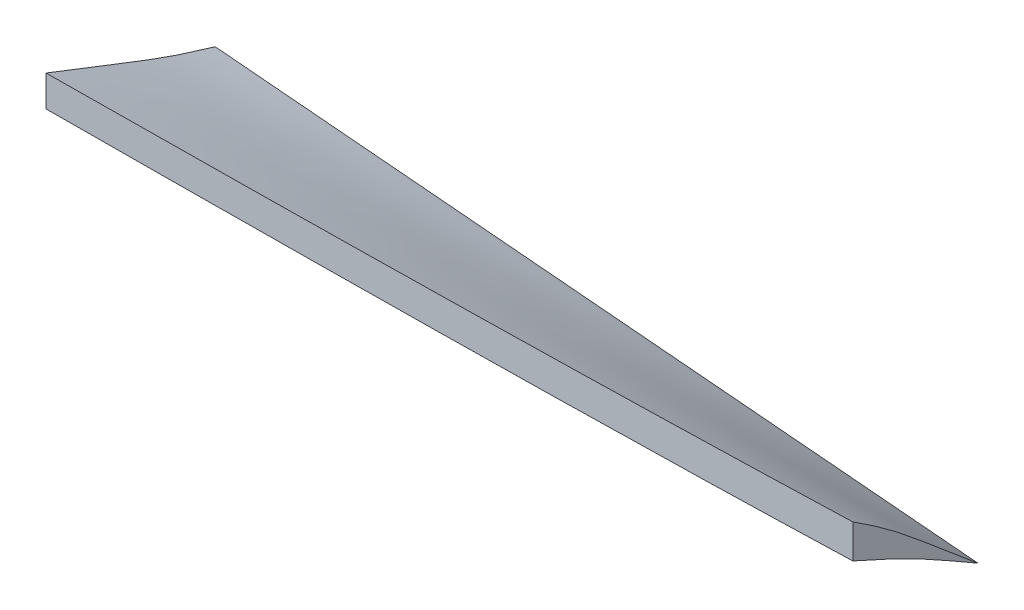
ISO-10303-21;
HEADER;
FILE_DESCRIPTION(('STEP AP214'),'2;1');
FILE_NAME('part.step','',(''),(''),'','','');
FILE_SCHEMA(('AUTOMOTIVE_DESIGN { 1 0 10303 214 1 1 1 1 }'));
ENDSEC;
DATA;
#1=APPLICATION_CONTEXT('core data for automotive mechanical design processes');
#2=APPLICATION_PROTOCOL_DEFINITION('international standard','automotive_design',2000,#1);
#3=PRODUCT_CONTEXT('',#1,'mechanical');
#4=PRODUCT('Part','Part','',(#3));
#5=PRODUCT_RELATED_PRODUCT_CATEGORY('part','',(#4));
#6=PRODUCT_DEFINITION_FORMATION('','',#4);
#7=PRODUCT_DEFINITION_CONTEXT('part definition',#1,'design');
#8=PRODUCT_DEFINITION('design','',#6,#7);
#9=PRODUCT_DEFINITION_SHAPE('','',#8);
#10=(LENGTH_UNIT() NAMED_UNIT(*) SI_UNIT(.MILLI.,.METRE.));
#11=(NAMED_UNIT(*) PLANE_ANGLE_UNIT() SI_UNIT($,.RADIAN.));
#12=(NAMED_UNIT(*) SI_UNIT($,.STERADIAN.) SOLID_ANGLE_UNIT());
#13=UNCERTAINTY_MEASURE_WITH_UNIT(LENGTH_MEASURE(1.E-05),#10,'distance_accuracy_value','');
#14=(GEOMETRIC_REPRESENTATION_CONTEXT(3) GLOBAL_UNCERTAINTY_ASSIGNED_CONTEXT((#13)) GLOBAL_UNIT_ASSIGNED_CONTEXT((#10,
#11,#12)) REPRESENTATION_CONTEXT('',''));
#15=CARTESIAN_POINT('',(0.,0.,0.));
#16=DIRECTION('',(0.,0.,1.));
#17=DIRECTION('',(1.,0.,0.));
#18=AXIS2_PLACEMENT_3D('',#15,#16,#17);
#19=CARTESIAN_POINT('',(374.396,61.9718742803303,-500.462069913375));
#20=DIRECTION('',(1.,0.,0.));
#21=DIRECTION('',(0.,0.,-1.));
#22=AXIS2_PLACEMENT_3D('',#19,#20,#21);
#23=PLANE('',#22);
#24=DIRECTION('',(0.,1.,0.));
#25=VECTOR('',#24,1.);
#26=CARTESIAN_POINT('',(374.396,61.9718742803303,-762.947336932218));
#27=LINE('',#26,#25);
#28=CARTESIAN_POINT('',(374.396,-2.40388597600074,-762.947336932218));
#29=VERTEX_POINT('',#28);
#30=CARTESIAN_POINT('',(374.396,1.23163319584544,-762.94733693398));
#31=VERTEX_POINT('',#30);
#32=EDGE_CURVE('E54',#29,#31,#27,.T.);
#33=ORIENTED_EDGE('',*,*,#32,.F.);
#34=CARTESIAN_POINT('',(374.396,0.,-241.3));
#35=CARTESIAN_POINT('',(374.396,-0.538954659703314,-241.297655184968));
#36=CARTESIAN_POINT('',(374.396,-1.7261603333214,-241.292490042168));
#37=CARTESIAN_POINT('',(374.396,-3.55475690139812,-241.690170496209));
#38=CARTESIAN_POINT('',(374.396,-5.28575044275841,-242.787647348631));
#39=CARTESIAN_POINT('',(374.396,-6.47819703634325,-244.55910096819));
#40=CARTESIAN_POINT('',(374.396,-7.23439961710996,-246.693492664323));
#41=CARTESIAN_POINT('',(374.396,-7.74934951346128,-249.131026639712));
#42=CARTESIAN_POINT('',(374.396,-8.1095524567562,-251.905250666347));
#43=CARTESIAN_POINT('',(374.396,-8.36536130938982,-255.097825264003));
#44=CARTESIAN_POINT('',(374.396,-8.53927775370538,-258.834169307143));
#45=CARTESIAN_POINT('',(374.396,-8.6228222097704,-263.297687326147));
#46=CARTESIAN_POINT('',(374.396,-8.59845411935391,-268.75143324473));
#47=CARTESIAN_POINT('',(374.396,-8.43043441446886,-275.5550068996));
#48=CARTESIAN_POINT('',(374.396,-8.06897383873518,-284.115477039142));
#49=CARTESIAN_POINT('',(374.396,-7.46729611245012,-294.701993416563));
#50=CARTESIAN_POINT('',(374.396,-6.56550935140482,-307.23866248115));
#51=CARTESIAN_POINT('',(374.396,-5.26774660320282,-321.351176792217));
#52=CARTESIAN_POINT('',(374.396,-3.4986121172012,-336.635216144863));
#53=CARTESIAN_POINT('',(374.396,-1.31741885957216,-352.842840734093));
#54=CARTESIAN_POINT('',(374.396,1.12162569591117,-369.80872672652));
#55=CARTESIAN_POINT('',(374.396,3.70484150758706,-387.306924798737));
#56=CARTESIAN_POINT('',(374.396,6.35085572360206,-405.053096077913));
#57=CARTESIAN_POINT('',(374.396,8.98235684046696,-422.799408725511));
#58=CARTESIAN_POINT('',(374.396,11.5300227909959,-440.376908078112));
#59=CARTESIAN_POINT('',(374.396,13.9430010682351,-457.707871031536));
#60=CARTESIAN_POINT('',(374.396,16.1729066622707,-474.772580756103));
#61=CARTESIAN_POINT('',(374.396,18.1852831627042,-491.576454148917));
#62=CARTESIAN_POINT('',(374.396,19.9445194919549,-508.13688707812));
#63=CARTESIAN_POINT('',(374.396,21.4228531653779,-524.480515326682));
#64=CARTESIAN_POINT('',(374.396,22.6006648317829,-540.633952092378));
#65=CARTESIAN_POINT('',(374.396,23.4570220295475,-556.625916689834));
#66=CARTESIAN_POINT('',(374.396,23.9811859014682,-572.479352868524));
#67=CARTESIAN_POINT('',(374.396,24.1589041565962,-588.217968124516));
#68=CARTESIAN_POINT('',(374.396,23.9828437048313,-603.859249005849));
#69=CARTESIAN_POINT('',(374.396,23.4456129995817,-619.418444987461));
#70=CARTESIAN_POINT('',(374.396,22.5455229148943,-634.89794778659));
#71=CARTESIAN_POINT('',(374.396,21.2803649513233,-650.289014071176));
#72=CARTESIAN_POINT('',(374.396,19.6554964574737,-665.556610194271));
#73=CARTESIAN_POINT('',(374.396,17.6770159172737,-680.627419737525));
#74=CARTESIAN_POINT('',(374.396,15.374920464339,-695.363311814011));
#75=CARTESIAN_POINT('',(374.396,12.7828970747854,-709.538692080346));
#76=CARTESIAN_POINT('',(374.396,9.97075851827043,-722.850908635221));
#77=CARTESIAN_POINT('',(374.396,7.01255821457496,-734.983994696583));
#78=CARTESIAN_POINT('',(374.396,3.96652793492765,-745.710637795198));
#79=CARTESIAN_POINT('',(374.396,0.871097223163982,-754.965559992787));
#80=CARTESIAN_POINT('',(374.396,-2.26764612386533,-762.812999366146));
#81=CARTESIAN_POINT('',(374.396,-5.55090807095211,-769.870558630561));
#82=CARTESIAN_POINT('',(374.396,-8.0522393298167,-774.178423342215));
#83=CARTESIAN_POINT('',(374.396,-9.34014397229244,-776.396489798407));
#84=B_SPLINE_CURVE_WITH_KNOTS('',3,(#34,#35,#36,#37,#38,#39,#40,#41,#42,#43,#44,#45,#46,#47,#48,
#49,#50,#51,#52,#53,#54,#55,#56,#57,#58,#59,#60,#61,#62,#63,#64,#65,#66,#67,#68,#69,#70,#71,#72,
#73,#74,#75,#76,#77,#78,#79,#80,#81,#82,#83),.UNSPECIFIED.,.F.,.F.,(4,1,1,1,1,1,1,1,1,1,1,1,1,1,
1,1,1,1,1,1,1,1,1,1,1,1,1,1,1,1,1,1,1,1,1,1,1,1,1,1,1,1,1,1,1,1,1,4),(0.,0.00295699573707231,
0.00651365017947627,0.0101253848931793,0.0139115751929899,0.0180004278100691,0.0225091316382041,
0.0275701977614678,0.0333552559313343,0.0400939348988516,0.0481089397634267,0.0578698759413965,
0.0700431416558855,0.0854823200575231,0.104922628293272,0.128274621706956,0.154506379577485,
0.182746709372674,0.212765692945345,0.244315984766029,0.276878379293871,0.309904596254752,
0.342852711105616,0.375404074373811,0.407445978793529,0.438949076096661,0.469916219615646,
0.500387507784893,0.530404994878598,0.560035323702218,0.589330242489587,0.618350497736926,
0.64714111982614,0.675762770521893,0.704247976592449,0.732632991406434,0.76090944583605,
0.789050397380166,0.816945539223071,0.844377954813452,0.870950736544431,0.89607601673736,
0.91908997684288,0.939522087621465,0.957298390503345,0.972656028240629,0.985920925887869,1.),.UNSPECIFIED.);
#85=CARTESIAN_POINT('',(374.396,-9.34014397229244,-776.396489798407));
#86=VERTEX_POINT('',#85);
#87=EDGE_CURVE('E48',#29,#86,#84,.T.);
#88=ORIENTED_EDGE('',*,*,#87,.T.);
#89=CARTESIAN_POINT('',(374.396,-9.34014397229245,-776.396489798407));
#90=CARTESIAN_POINT('',(374.396,-8.40175484291137,-775.264229702307));
#91=CARTESIAN_POINT('',(374.396,-6.09606028875458,-772.482179211869));
#92=CARTESIAN_POINT('',(374.396,-2.17943506157781,-768.02376491039));
#93=CARTESIAN_POINT('',(374.396,1.84859835881143,-762.218322929233));
#94=CARTESIAN_POINT('',(374.396,5.6003449114185,-755.243229685749));
#95=CARTESIAN_POINT('',(374.396,9.33547168888237,-746.912760700583));
#96=CARTESIAN_POINT('',(374.396,13.2386089066728,-737.018252871707));
#97=CARTESIAN_POINT('',(374.396,17.3161821827427,-725.47867829808));
#98=CARTESIAN_POINT('',(374.396,21.5115819527909,-712.428375502739));
#99=CARTESIAN_POINT('',(374.396,25.7421233345226,-698.167711363482));
#100=CARTESIAN_POINT('',(374.396,29.9240395368495,-683.062552056113));
#101=CARTESIAN_POINT('',(374.396,33.9819197101395,-667.44471749513));
#102=CARTESIAN_POINT('',(374.396,37.8587807196238,-651.563094478592));
#103=CARTESIAN_POINT('',(374.396,41.5075682698668,-635.571677798897));
#104=CARTESIAN_POINT('',(374.396,44.8962045562709,-619.54213496093));
#105=CARTESIAN_POINT('',(374.396,48.0062629675248,-603.480438344816));
#106=CARTESIAN_POINT('',(374.396,50.8384531277133,-587.348007896632));
#107=CARTESIAN_POINT('',(374.396,53.4037267628393,-571.079262558276));
#108=CARTESIAN_POINT('',(374.396,55.7297505453312,-554.597347914761));
#109=CARTESIAN_POINT('',(374.396,57.8518789503547,-537.831743695071));
#110=CARTESIAN_POINT('',(374.396,59.8203943308259,-520.741731840539));
#111=CARTESIAN_POINT('',(374.396,61.6856473828784,-503.340217598354));
#112=CARTESIAN_POINT('',(374.396,63.4899259876005,-485.710728793018));
#113=CARTESIAN_POINT('',(374.396,65.2498913593578,-468.011203683683));
#114=CARTESIAN_POINT('',(374.396,66.9517721977821,-450.459510763352));
#115=CARTESIAN_POINT('',(374.396,68.5378660271085,-433.311455418955));
#116=CARTESIAN_POINT('',(374.396,69.9289151057664,-416.841536857024));
#117=CARTESIAN_POINT('',(374.396,71.0327683067303,-401.296477173787));
#118=CARTESIAN_POINT('',(374.396,71.7296272901284,-386.808729152987));
#119=CARTESIAN_POINT('',(374.396,71.8938086245965,-373.351309186629));
#120=CARTESIAN_POINT('',(374.396,71.4602978508936,-360.783321416241));
#121=CARTESIAN_POINT('',(374.396,70.4184719929158,-348.941977505793));
#122=CARTESIAN_POINT('',(374.396,68.7634225939546,-337.701052477739));
#123=CARTESIAN_POINT('',(374.396,66.4985267442778,-326.980618986022));
#124=CARTESIAN_POINT('',(374.396,63.6364757752088,-316.739864214787));
#125=CARTESIAN_POINT('',(374.396,60.2063348553058,-306.973125092115));
#126=CARTESIAN_POINT('',(374.396,56.2453758331957,-297.713837697883));
#127=CARTESIAN_POINT('',(374.396,51.8366046907402,-289.029736201877));
#128=CARTESIAN_POINT('',(374.396,47.1113365011114,-281.025296442116));
#129=CARTESIAN_POINT('',(374.396,42.2563698958084,-273.817045833498));
#130=CARTESIAN_POINT('',(374.396,37.4675939077021,-267.502444449423));
#131=CARTESIAN_POINT('',(374.396,32.9120113189413,-262.11107633905));
#132=CARTESIAN_POINT('',(374.396,28.6710997916291,-257.609906739654));
#133=CARTESIAN_POINT('',(374.396,24.7595382100328,-253.911291370847));
#134=CARTESIAN_POINT('',(374.396,21.1572388306981,-250.902182399076));
#135=CARTESIAN_POINT('',(374.396,17.8395196406259,-248.463647547404));
#136=CARTESIAN_POINT('',(374.396,14.7801988216139,-246.49190181607));
#137=CARTESIAN_POINT('',(374.396,11.9506148597635,-244.907396988431));
#138=CARTESIAN_POINT('',(374.396,9.32321496425856,-243.64953423366));
#139=CARTESIAN_POINT('',(374.396,6.87061839463228,-242.679778651959));
#140=CARTESIAN_POINT('',(374.396,4.57158692532996,-241.966757378294));
#141=CARTESIAN_POINT('',(374.396,2.40963479027394,-241.495055010141));
#142=CARTESIAN_POINT('',(374.396,0.894237049815755,-241.32398184574));
#143=CARTESIAN_POINT('',(374.396,0.107544091622905,-241.302884141123));
#144=CARTESIAN_POINT('',(374.396,0.,-241.3));
#145=B_SPLINE_CURVE_WITH_KNOTS('',3,(#89,#90,#91,#92,#93,#94,#95,#96,#97,#98,#99,#100,#101,#102,
#103,#104,#105,#106,#107,#108,#109,#110,#111,#112,#113,#114,#115,#116,#117,#118,#119,#120,#121,
#122,#123,#124,#125,#126,#127,#128,#129,#130,#131,#132,#133,#134,#135,#136,#137,#138,#139,#140,
#141,#142,#143,#144),.UNSPECIFIED.,.F.,.F.,(4,1,1,1,1,1,1,1,1,1,1,1,1,1,1,1,1,1,1,1,1,1,1,1,1,1,
1,1,1,1,1,1,1,1,1,1,1,1,1,1,1,1,1,1,1,1,1,1,1,1,1,1,1,4),(0.,0.00766402095757611,
0.0188310913155853,0.0309061878624514,0.044388540676871,0.0600474083532868,0.0784606788934647,
0.0998047207561698,0.123816969987705,0.149890658407643,0.177317925985823,0.205492409209094,
0.233979752311192,0.262509715956203,0.290967606389999,0.319357501013423,0.347763187640679,
0.376320625595132,0.405182950986283,0.434503841432051,0.464386678217646,0.494832433453987,
0.525708038913636,0.556739737234784,0.587525557609377,0.617604809699268,0.646485108208642,
0.67366014348048,0.698815639347954,0.722062593959947,0.743776305511465,0.764323117717657,
0.783977995344401,0.802952239366703,0.821385981311945,0.839352413735504,0.856858699994966,
0.873830573178779,0.890070807540379,0.905268010379337,0.919095859386137,0.931350851483357,
0.942034396352869,0.951307872005367,0.959388407782576,0.966479389489374,0.972752010348399,
0.978344065778329,0.983368996467432,0.987921251922054,0.992076472154305,0.995898893569495,
0.99943936225551,1.),.UNSPECIFIED.);
#146=EDGE_CURVE('E101',#86,#31,#145,.T.);
#147=ORIENTED_EDGE('',*,*,#146,.T.);
#148=EDGE_LOOP('',(#33,#88,#147));
#149=FACE_BOUND('',#148,.T.);
#150=ADVANCED_FACE('F36',(#149),#23,.T.);
#151=CARTESIAN_POINT('',(266.7,66.8514364736246,-396.625549586027));
#152=DIRECTION('',(1.,0.,0.));
#153=DIRECTION('',(0.,0.,-1.));
#154=AXIS2_PLACEMENT_3D('',#151,#152,#153);
#155=PLANE('',#154);
#156=CARTESIAN_POINT('',(266.7,0.,2.22044604925031E-13));
#157=CARTESIAN_POINT('',(266.7,-0.519005663251776,-0.017452032873233));
#158=CARTESIAN_POINT('',(266.7,-1.83376590691603,-0.0616620302726911));
#159=CARTESIAN_POINT('',(266.7,-4.39681155696864,-0.570189514822628));
#160=CARTESIAN_POINT('',(266.7,-10.6163864618155,-2.53612961981586));
#161=CARTESIAN_POINT('',(266.7,-20.5501355548249,-7.99821180015903));
#162=CARTESIAN_POINT('',(266.7,-34.1849518234197,-16.113653600363));
#163=CARTESIAN_POINT('',(266.7,-48.9001609581499,-25.7512677237677));
#164=CARTESIAN_POINT('',(266.7,-62.9387722637982,-36.9320129206593));
#165=CARTESIAN_POINT('',(266.7,-75.9185649305428,-49.3363693895977));
#166=CARTESIAN_POINT('',(266.7,-85.6249870081858,-65.2269065389885));
#167=CARTESIAN_POINT('',(266.7,-91.7173571850375,-84.4527650461813));
#168=CARTESIAN_POINT('',(266.7,-96.1515107337435,-106.852134497504));
#169=CARTESIAN_POINT('',(266.7,-98.572249175019,-132.510932075947));
#170=CARTESIAN_POINT('',(266.7,-99.0923828679342,-161.194365788217));
#171=CARTESIAN_POINT('',(266.7,-97.704243710744,-192.761343292207));
#172=CARTESIAN_POINT('',(266.7,-94.5118392960195,-227.038217577403));
#173=CARTESIAN_POINT('',(266.7,-89.6638281224946,-263.834756502374));
#174=CARTESIAN_POINT('',(266.7,-83.3884450275636,-302.921473177158));
#175=CARTESIAN_POINT('',(266.7,-75.9777868038037,-344.017776041357));
#176=CARTESIAN_POINT('',(266.7,-67.7807073824362,-386.776799789028));
#177=CARTESIAN_POINT('',(266.7,-59.2023239554158,-430.774614869882));
#178=CARTESIAN_POINT('',(266.7,-50.6638051201837,-475.496263681297));
#179=CARTESIAN_POINT('',(266.7,-42.6036124709931,-520.335279967129));
#180=CARTESIAN_POINT('',(266.7,-35.422796347196,-564.588870456406));
#181=CARTESIAN_POINT('',(266.7,-29.4733080838114,-607.47093439981));
#182=CARTESIAN_POINT('',(266.7,-25.0144733830484,-648.127538759038));
#183=CARTESIAN_POINT('',(266.7,-22.1862417822715,-685.667615873134));
#184=CARTESIAN_POINT('',(266.7,-21.0047614095253,-719.196759596281));
#185=CARTESIAN_POINT('',(266.7,-21.2786363122994,-747.830287498173));
#186=CARTESIAN_POINT('',(266.7,-22.8547119223245,-770.688405742853));
#187=CARTESIAN_POINT('',(266.7,-25.0735156397646,-787.091395164078));
#188=CARTESIAN_POINT('',(266.7,-26.8193281874778,-796.842303094878));
#189=CARTESIAN_POINT('',(266.7,-27.7751407453036,-801.097715574997));
#190=CARTESIAN_POINT('',(266.7,-28.0117320332951,-802.151053398607));
#191=B_SPLINE_CURVE_WITH_KNOTS('',3,(#156,#157,#158,#159,#160,#161,#162,#163,#164,#165,#166,
#167,#168,#169,#170,#171,#172,#173,#174,#175,#176,#177,#178,#179,#180,#181,#182,#183,#184,#185,
#186,#187,#188,#189,#190),.UNSPECIFIED.,.F.,.F.,(4,1,1,1,1,1,1,1,1,1,1,1,1,1,1,1,1,1,1,1,1,1,1,
1,1,1,1,1,1,1,1,1,4),(0.,0.00182090933464196,0.00461278049497482,0.00913453013845994,
0.0246759391487866,0.0441527676320363,0.064937102928184,0.0863209881898911,0.107137618403306,
0.127599776801144,0.150892792929449,0.177565203441126,0.207667777211646,0.241222088418686,
0.278203414074027,0.318526302563412,0.362030578586225,0.408464624639153,0.457479061609077,
0.508614437318857,0.56129601455956,0.61483529472868,0.668437533813961,0.721214466101836,
0.772202341152847,0.82039348306447,0.86476592329606,0.904323703961063,0.938131580580512,
0.965241743376092,0.984690446789536,0.996210442222917,1.),.UNSPECIFIED.);
#192=CARTESIAN_POINT('',(266.7,-24.7019448750279,-783.964772228695));
#193=VERTEX_POINT('',#192);
#194=CARTESIAN_POINT('',(266.7,-28.0117320332951,-802.151053398607));
#195=VERTEX_POINT('',#194);
#196=EDGE_CURVE('E82',#193,#195,#191,.T.);
#197=ORIENTED_EDGE('',*,*,#196,.F.);
#198=DIRECTION('',(0.,1.,0.));
#199=VECTOR('',#198,1.);
#200=CARTESIAN_POINT('',(266.7,66.8514364736246,-783.964772228695));
#201=LINE('',#200,#199);
#202=CARTESIAN_POINT('',(266.7,-21.3623541395567,-783.964772228696));
#203=VERTEX_POINT('',#202);
#204=EDGE_CURVE('E73',#193,#203,#201,.T.);
#205=ORIENTED_EDGE('',*,*,#204,.T.);
#206=CARTESIAN_POINT('',(266.7,-28.0117320332951,-802.151053398607));
#207=CARTESIAN_POINT('',(266.7,-27.7105421234966,-801.137231832083));
#208=CARTESIAN_POINT('',(266.7,-26.5641562509699,-797.278434829008));
#209=CARTESIAN_POINT('',(266.7,-23.4586005929746,-789.35722595566));
#210=CARTESIAN_POINT('',(266.7,-18.6435790763109,-777.06146068027));
#211=CARTESIAN_POINT('',(266.7,-13.040064965801,-760.58172221373));
#212=CARTESIAN_POINT('',(266.7,-7.12332820026992,-739.996750309987));
#213=CARTESIAN_POINT('',(266.7,-0.379813283306496,-715.577161880766));
#214=CARTESIAN_POINT('',(266.7,7.01302179788049,-687.646997388513));
#215=CARTESIAN_POINT('',(266.7,14.9584437350902,-656.683490082779));
#216=CARTESIAN_POINT('',(266.7,23.2583450492186,-623.158916560123));
#217=CARTESIAN_POINT('',(266.7,31.6943761736925,-587.549187867879));
#218=CARTESIAN_POINT('',(266.7,40.0261592775311,-550.319226889966));
#219=CARTESIAN_POINT('',(266.7,48.0016259470944,-511.914813654682));
#220=CARTESIAN_POINT('',(266.7,55.374538475184,-472.761711336735));
#221=CARTESIAN_POINT('',(266.7,61.9127756173434,-433.262164148353));
#222=CARTESIAN_POINT('',(266.7,67.4048011857756,-393.795881301525));
#223=CARTESIAN_POINT('',(266.7,71.6551802592197,-354.719946084274));
#224=CARTESIAN_POINT('',(266.7,74.5356984510162,-316.356950184387));
#225=CARTESIAN_POINT('',(266.7,75.7535877143672,-278.931254813949));
#226=CARTESIAN_POINT('',(266.7,75.3938232860087,-242.699408929629));
#227=CARTESIAN_POINT('',(266.7,73.5466559514521,-207.870582877245));
#228=CARTESIAN_POINT('',(266.7,70.2589806515456,-174.746776105023));
#229=CARTESIAN_POINT('',(266.7,65.7681833795225,-143.601377812806));
#230=CARTESIAN_POINT('',(266.7,60.1874606388896,-114.762118238696));
#231=CARTESIAN_POINT('',(266.7,53.6284711641162,-88.5344901534683));
#232=CARTESIAN_POINT('',(266.7,46.23822310474,-65.1989800417861));
#233=CARTESIAN_POINT('',(266.7,38.1338729096921,-45.0005898028449));
#234=CARTESIAN_POINT('',(266.7,29.5092329050107,-28.1586169294015));
#235=CARTESIAN_POINT('',(266.7,20.5578270147687,-14.8710331109794));
#236=CARTESIAN_POINT('',(266.7,12.3132643573259,-6.14419143155653));
#237=CARTESIAN_POINT('',(266.7,6.17648660124204,-1.9481025776692));
#238=CARTESIAN_POINT('',(266.7,3.0841226330873,-0.639134364117389));
#239=CARTESIAN_POINT('',(266.7,1.66803034708105,-0.217045478239974));
#240=CARTESIAN_POINT('',(266.7,0.777840261453222,-0.042563088957337));
#241=CARTESIAN_POINT('',(266.7,0.196310087295787,-0.0107420046178697));
#242=CARTESIAN_POINT('',(266.7,0.,0.));
#243=B_SPLINE_CURVE_WITH_KNOTS('',3,(#206,#207,#208,#209,#210,#211,#212,#213,#214,#215,#216,
#217,#218,#219,#220,#221,#222,#223,#224,#225,#226,#227,#228,#229,#230,#231,#232,#233,#234,#235,
#236,#237,#238,#239,#240,#241,#242),.UNSPECIFIED.,.F.,.F.,(4,1,1,1,1,1,1,1,1,1,1,1,1,1,1,1,1,1,
1,1,1,1,1,1,1,1,1,1,1,1,1,1,1,1,4),(0.,0.0038023449945569,0.0144724456001439,0.0305636248499039,
0.0512990586437873,0.0770284704780323,0.1075738110133,0.142399412839652,0.180921149261364,
0.222524680037491,0.266590974271359,0.312514686460119,0.359710118436383,0.407632336843648,
0.455773216728113,0.503669018265595,0.550900956266296,0.59709618330248,0.64197604819215,
0.685511898484932,0.727353251544964,0.767353583197193,0.805169064220494,0.840471251936796,
0.872937278412314,0.902335208905147,0.928425322985344,0.95111304623239,0.970252676129248,
0.985871491026606,0.993981783732224,0.996752649298779,0.997906779196307,0.999293380847839,1.),.UNSPECIFIED.);
#244=EDGE_CURVE('E81',#195,#203,#243,.T.);
#245=ORIENTED_EDGE('',*,*,#244,.F.);
#246=EDGE_LOOP('',(#197,#205,#245));
#247=FACE_BOUND('',#246,.T.);
#248=ADVANCED_FACE('F80',(#247),#155,.F.);
#249=CARTESIAN_POINT('',(266.7,0.,2.22044604925031E-13));
#250=CARTESIAN_POINT('',(374.396,0.,-241.3));
#251=CARTESIAN_POINT('',(266.7,-0.519005663251776,-0.017452032873233));
#252=CARTESIAN_POINT('',(374.396,-0.331886704636986,-241.298556069755));
#253=CARTESIAN_POINT('',(266.7,-1.3618249649772,-0.0457925910221828));
#254=CARTESIAN_POINT('',(374.396,-0.870841364341308,-241.296211254686));
#255=CARTESIAN_POINT('',(266.7,-2.6634654039068,-0.226280634755372));
#256=CARTESIAN_POINT('',(374.396,-1.70943421464947,-241.344222492389));
#257=CARTESIAN_POINT('',(266.7,-3.97403038996995,-0.509651519022748));
#258=CARTESIAN_POINT('',(374.396,-2.55920664922827,-241.473659712357));
#259=CARTESIAN_POINT('',(266.7,-5.67385444121891,-0.973848906397344));
#260=CARTESIAN_POINT('',(374.396,-3.64262077740679,-241.803197439326));
#261=CARTESIAN_POINT('',(266.7,-7.16309300403349,-1.47525432920108));
#262=CARTESIAN_POINT('',(374.396,-4.53090319650363,-242.30906244344));
#263=CARTESIAN_POINT('',(266.7,-9.13382191892448,-2.21755656123289));
#264=CARTESIAN_POINT('',(374.396,-5.55782495136222,-243.191830962093));
#265=CARTESIAN_POINT('',(266.7,-11.453768061813,-3.21073121014721));
#266=CARTESIAN_POINT('',(374.396,-6.47819703634325,-244.55910096819));
#267=CARTESIAN_POINT('',(266.7,-14.617973091907,-4.77970463040736));
#268=CARTESIAN_POINT('',(374.396,-7.23439961710996,-246.693492664323));
#269=CARTESIAN_POINT('',(266.7,-17.3166062761094,-6.25777311353042));
#270=CARTESIAN_POINT('',(374.396,-7.64023176274066,-248.614513816651));
#271=CARTESIAN_POINT('',(266.7,-19.6956552854928,-7.60639519180477));
#272=CARTESIAN_POINT('',(374.396,-7.90594773867192,-250.337120501505));
#273=CARTESIAN_POINT('',(266.7,-22.3812018585213,-9.14631621312915));
#274=CARTESIAN_POINT('',(374.396,-8.14107334072312,-252.298641170282));
#275=CARTESIAN_POINT('',(266.7,-26.1735562664804,-11.3644547961668));
#276=CARTESIAN_POINT('',(374.396,-8.36536130938982,-255.097825264003));
#277=CARTESIAN_POINT('',(266.7,-30.2167539485569,-13.7991824723));
#278=CARTESIAN_POINT('',(374.396,-8.50577797119065,-258.114474781775));
#279=CARTESIAN_POINT('',(266.7,-33.7898551936557,-16.006465809378));
#280=CARTESIAN_POINT('',(374.396,-8.57607507063383,-260.800134433941));
#281=CARTESIAN_POINT('',(266.7,-38.0749689864005,-18.7045105812848));
#282=CARTESIAN_POINT('',(374.396,-8.61951975158411,-264.03680013913));
#283=CARTESIAN_POINT('',(266.7,-43.0326466847677,-21.9489678007733));
#284=CARTESIAN_POINT('',(374.396,-8.60260863384226,-267.821624382103));
#285=CARTESIAN_POINT('',(266.7,-48.1556543500042,-25.5292516620161));
#286=CARTESIAN_POINT('',(374.396,-8.52279965656649,-271.814887678518));
#287=CARTESIAN_POINT('',(266.7,-54.4787814064188,-30.2051721674396));
#288=CARTESIAN_POINT('',(374.396,-8.37614377666767,-276.840771973178));
#289=CARTESIAN_POINT('',(266.7,-59.21097416833,-34.0450840120657));
#290=CARTESIAN_POINT('',(374.396,-8.21187216466257,-280.731216253276));
#291=CARTESIAN_POINT('',(266.7,-66.7177473674311,-40.5837955754244));
#292=CARTESIAN_POINT('',(374.396,-7.90078272144247,-287.074798848759));
#293=CARTESIAN_POINT('',(266.7,-71.2212759750493,-44.8473264489632));
#294=CARTESIAN_POINT('',(374.396,-7.67586937060329,-291.011671029708));
#295=CARTESIAN_POINT('',(266.7,-78.7147601260786,-53.9140647830376));
#296=CARTESIAN_POINT('',(374.396,-7.19227953762016,-298.512563555816));
#297=CARTESIAN_POINT('',(266.7,-82.225027577047,-59.6607791632406));
#298=CARTESIAN_POINT('',(374.396,-6.88444295994953,-302.753693364615));
#299=CARTESIAN_POINT('',(266.7,-87.4534530628719,-70.9970466703564));
#300=CARTESIAN_POINT('',(374.396,-6.24053273005785,-310.695056733583));
#301=CARTESIAN_POINT('',(266.7,-89.7697096736798,-78.3446750738636));
#302=CARTESIAN_POINT('',(374.396,-5.79892956830818,-315.574830378182));
#303=CARTESIAN_POINT('',(266.7,-93.2074407087006,-91.9800035581626));
#304=CARTESIAN_POINT('',(374.396,-4.88972790908421,-324.504044619292));
#305=CARTESIAN_POINT('',(266.7,-94.9135603303454,-100.900000700637));
#306=CARTESIAN_POINT('',(374.396,-4.23566514532944,-330.267612338575));
#307=CARTESIAN_POINT('',(266.7,-97.005165128164,-115.900507892542));
#308=CARTESIAN_POINT('',(374.396,-3.05208518184974,-339.875237406886));
#309=CARTESIAN_POINT('',(266.7,-97.8865275960693,-125.902245338752));
#310=CARTESIAN_POINT('',(374.396,-2.20748872519501,-346.22906719993));
#311=CARTESIAN_POINT('',(266.7,-98.75417769385,-142.543611522293));
#312=CARTESIAN_POINT('',(374.396,-0.74886429526847,-356.776450878177));
#313=CARTESIAN_POINT('',(266.7,-98.8967324071274,-152.988210306159));
#314=CARTESIAN_POINT('',(374.396,0.197735976323111,-363.382190722137));
#315=CARTESIAN_POINT('',(266.7,-98.6388148142237,-171.252474350066));
#316=CARTESIAN_POINT('',(374.396,1.8783669007804,-374.934743465949));
#317=CARTESIAN_POINT('',(266.7,-98.167165219046,-181.781622659568));
#318=CARTESIAN_POINT('',(374.396,2.86181165787558,-381.59640567588));
#319=CARTESIAN_POINT('',(266.7,-96.9252639056158,-200.427096468206));
#320=CARTESIAN_POINT('',(374.396,4.61482322733841,-393.409950006193));
#321=CARTESIAN_POINT('',(266.7,-95.8892856649466,-212.248563796527));
#322=CARTESIAN_POINT('',(374.396,5.73307738434339,-400.910635156407));
#323=CARTESIAN_POINT('',(266.7,-93.9170501098702,-230.560974680308));
#324=CARTESIAN_POINT('',(374.396,7.46322094477587,-412.554662718623));
#325=CARTESIAN_POINT('',(266.7,-92.1057468529205,-245.300525783924));
#326=CARTESIAN_POINT('',(374.396,8.85139442738161,-421.944119431141));
#327=CARTESIAN_POINT('',(266.7,-89.8666738732242,-261.34924066548));
#328=CARTESIAN_POINT('',(374.396,10.3438260637576,-432.1928005028));
#329=CARTESIAN_POINT('',(266.7,-87.1381441062203,-279.547204739609));
#330=CARTESIAN_POINT('',(374.396,12.0115787545206,-443.835633190795));
#331=CARTESIAN_POINT('',(266.7,-85.0097430183189,-292.603367172898));
#332=CARTESIAN_POINT('',(374.396,13.1775369513835,-452.210005436779));
#333=CARTESIAN_POINT('',(266.7,-81.9768416077611,-310.449999196815));
#334=CARTESIAN_POINT('',(374.396,14.7230268076779,-463.677142940125));
#335=CARTESIAN_POINT('',(266.7,-79.4997720108798,-324.486370546341));
#336=CARTESIAN_POINT('',(374.396,15.9019157810272,-472.711102593387));
#337=CARTESIAN_POINT('',(266.7,-76.3354462343199,-341.704088509269));
#338=CARTESIAN_POINT('',(374.396,17.256226478449,-483.818586327657));
#339=CARTESIAN_POINT('',(266.7,-73.11330510943,-358.907075437163));
#340=CARTESIAN_POINT('',(374.396,18.5417239937417,-494.931781899646));
#341=CARTESIAN_POINT('',(266.7,-70.3759298068697,-373.214643626466));
#342=CARTESIAN_POINT('',(374.396,19.5253586437092,-504.19114937449));
#343=CARTESIAN_POINT('',(266.7,-67.1096041275571,-390.133820811262));
#344=CARTESIAN_POINT('',(374.396,20.5793335961559,-515.155035898326));
#345=CARTESIAN_POINT('',(266.7,-63.8734968884462,-406.814797843799));
#346=CARTESIAN_POINT('',(374.396,21.5317971237121,-525.974658568893));
#347=CARTESIAN_POINT('',(266.7,-61.0133621780533,-421.54722005373));
#348=CARTESIAN_POINT('',(374.396,22.2294255076911,-535.542483636339));
#349=CARTESIAN_POINT('',(266.7,-57.8321293832433,-438.029181500437));
#350=CARTESIAN_POINT('',(374.396,22.9014618730221,-546.251159079221));
#351=CARTESIAN_POINT('',(266.7,-54.8900972631222,-453.360486195974));
#352=CARTESIAN_POINT('',(374.396,23.4306621830767,-556.216150002343));
#353=CARTESIAN_POINT('',(266.7,-51.8871003453324,-469.33391942981));
#354=CARTESIAN_POINT('',(374.396,23.7867838395826,-566.599625466069));
#355=CARTESIAN_POINT('',(266.7,-48.8916261777276,-485.52799842522));
#356=CARTESIAN_POINT('',(374.396,24.0336281183519,-577.123602127611));
#357=CARTESIAN_POINT('',(266.7,-46.1649694476022,-500.552592435812));
#358=CARTESIAN_POINT('',(374.396,24.1438423700701,-586.884105922058));
#359=CARTESIAN_POINT('',(266.7,-43.3544640433365,-516.664631646372));
#360=CARTESIAN_POINT('',(374.396,24.0562428641255,-597.338438366863));
#361=CARTESIAN_POINT('',(266.7,-40.632213355911,-532.703647959634));
#362=CARTESIAN_POINT('',(374.396,23.8490170930789,-607.735115480837));
#363=CARTESIAN_POINT('',(266.7,-38.2057415102212,-547.541695853908));
#364=CARTESIAN_POINT('',(374.396,23.5173669837782,-617.340316742621));
#365=CARTESIAN_POINT('',(266.7,-35.7378428697099,-563.553708719992));
#366=CARTESIAN_POINT('',(374.396,22.9651406808118,-627.68147635491));
#367=CARTESIAN_POINT('',(266.7,-33.3794153776786,-579.522261616508));
#368=CARTESIAN_POINT('',(374.396,22.2924017289982,-637.977250974283));
#369=CARTESIAN_POINT('',(266.7,-31.3921839739352,-593.911474256049));
#370=CARTESIAN_POINT('',(374.396,21.5317192441452,-647.231205723815));
#371=CARTESIAN_POINT('',(266.7,-29.3660049958083,-609.855513064526));
#372=CARTESIAN_POINT('',(374.396,20.5177858170183,-657.454363315461));
#373=CARTESIAN_POINT('',(266.7,-27.4821776509517,-625.707993003144));
#374=CARTESIAN_POINT('',(374.396,19.3878173782554,-667.595619595499));
#375=CARTESIAN_POINT('',(266.7,-26.0551277469561,-639.363004579966));
#376=CARTESIAN_POINT('',(374.396,18.245527457778,-676.296859504056));
#377=CARTESIAN_POINT('',(266.7,-24.5948079611536,-655.05729262507));
#378=CARTESIAN_POINT('',(374.396,16.7960088815145,-686.266814307816));
#379=CARTESIAN_POINT('',(266.7,-23.4694594123956,-668.635033118669));
#380=CARTESIAN_POINT('',(374.396,15.437659586113,-694.868483727388));
#381=CARTESIAN_POINT('',(266.7,-22.5515055669474,-683.009336930279));
#382=CARTESIAN_POINT('',(374.396,13.808500572683,-703.929823100315));
#383=CARTESIAN_POINT('',(266.7,-21.7989659011648,-697.718534363653));
#384=CARTESIAN_POINT('',(374.396,12.0154999317075,-713.171428073591));
#385=CARTESIAN_POINT('',(266.7,-21.3983991838216,-708.982115212396));
#386=CARTESIAN_POINT('',(374.396,10.5265566907603,-720.219848506321));
#387=CARTESIAN_POINT('',(266.7,-21.1774878669688,-722.695229287603));
#388=CARTESIAN_POINT('',(374.396,8.53103302363648,-728.755956143095));
#389=CARTESIAN_POINT('',(266.7,-21.1528367859848,-734.677989823989));
#390=CARTESIAN_POINT('',(374.396,6.66393929910598,-736.183474334445));
#391=CARTESIAN_POINT('',(266.7,-21.3928438290913,-744.704050604341));
#392=CARTESIAN_POINT('',(374.396,4.92014472235172,-742.352461417276));
#393=CARTESIAN_POINT('',(266.7,-21.8697638410092,-755.58036736302));
#394=CARTESIAN_POINT('',(374.396,2.86616747391412,-749.000567825704));
#395=CARTESIAN_POINT('',(266.7,-22.355437153206,-763.291834582696));
#396=CARTESIAN_POINT('',(374.396,1.29954778983049,-753.684550327495));
#397=CARTESIAN_POINT('',(266.7,-23.2588301525727,-772.688644260209));
#398=CARTESIAN_POINT('',(374.396,-0.868760958720117,-759.315527508768));
#399=CARTESIAN_POINT('',(266.7,-24.1736594816359,-780.439012654354));
#400=CARTESIAN_POINT('',(374.396,-2.7920044138194,-763.919051463631));
#401=CARTESIAN_POINT('',(266.7,-25.0232012596895,-786.269991852081));
#402=CARTESIAN_POINT('',(374.396,-4.37377975950631,-767.340254026866));
#403=CARTESIAN_POINT('',(266.7,-26.1121746466343,-792.892629873239));
#404=CARTESIAN_POINT('',(374.396,-6.33607102631374,-771.153076086345));
#405=CARTESIAN_POINT('',(266.7,-26.8961499835263,-797.184324579084));
#406=CARTESIAN_POINT('',(374.396,-7.70558378875242,-773.581403188584));
#407=CARTESIAN_POINT('',(266.7,-27.7751407453036,-801.097715574997));
#408=CARTESIAN_POINT('',(374.396,-8.99348843122743,-775.799469644794));
#409=CARTESIAN_POINT('',(266.7,-28.0117320332951,-802.151053398607));
#410=CARTESIAN_POINT('',(374.396,-9.34014397229244,-776.396489798407));
#411=B_SPLINE_SURFACE_WITH_KNOTS('',3,1,((#249,#250),(#251,#252),(#253,#254),(#255,#256),(#257,
#258),(#259,#260),(#261,#262),(#263,#264),(#265,#266),(#267,#268),(#269,#270),(#271,#272),(#273,
#274),(#275,#276),(#277,#278),(#279,#280),(#281,#282),(#283,#284),(#285,#286),(#287,#288),(#289,
#290),(#291,#292),(#293,#294),(#295,#296),(#297,#298),(#299,#300),(#301,#302),(#303,#304),(#305,
#306),(#307,#308),(#309,#310),(#311,#312),(#313,#314),(#315,#316),(#317,#318),(#319,#320),(#321,
#322),(#323,#324),(#325,#326),(#327,#328),(#329,#330),(#331,#332),(#333,#334),(#335,#336),(#337,
#338),(#339,#340),(#341,#342),(#343,#344),(#345,#346),(#347,#348),(#349,#350),(#351,#352),(#353,
#354),(#355,#356),(#357,#358),(#359,#360),(#361,#362),(#363,#364),(#365,#366),(#367,#368),(#369,
#370),(#371,#372),(#373,#374),(#375,#376),(#377,#378),(#379,#380),(#381,#382),(#383,#384),(#385,
#386),(#387,#388),(#389,#390),(#391,#392),(#393,#394),(#395,#396),(#397,#398),(#399,#400),(#401,
#402),(#403,#404),(#405,#406),(#407,#408),(#409,#410)),.UNSPECIFIED.,.F.,.F.,.F.,(4,1,1,1,1,1,1,
1,1,1,1,1,1,1,1,1,1,1,1,1,1,1,1,1,1,1,1,1,1,1,1,1,1,1,1,1,1,1,1,1,1,1,1,1,1,1,1,1,1,1,1,1,1,1,1,
1,1,1,1,1,1,1,1,1,1,1,1,1,1,1,1,1,1,1,1,1,1,1,4),(2,2),(0.,0.00182090933464196,
0.00295699573707231,0.00461278049497482,0.00651365017947627,0.00913453013845995,
0.0101253848931793,0.0139115751929899,0.0180004278100691,0.0225091316382041,0.0246759391487866,
0.0275701977614678,0.0333552559313344,0.0400939348988516,0.0441527676320363,0.0481089397634267,
0.0578698759413965,0.064937102928184,0.0700431416558856,0.0854823200575231,0.0863209881898911,
0.104922628293272,0.107137618403306,0.127599776801144,0.128274621706956,0.150892792929449,
0.154506379577485,0.177565203441126,0.182746709372674,0.207667777211646,0.212765692945345,
0.241222088418686,0.244315984766029,0.276878379293871,0.278203414074027,0.309904596254752,
0.318526302563412,0.342852711105616,0.362030578586225,0.375404074373811,0.407445978793529,
0.408464624639154,0.438949076096661,0.457479061609077,0.469916219615646,0.500387507784893,
0.508614437318857,0.530404994878599,0.560035323702218,0.56129601455956,0.589330242489588,
0.61483529472868,0.618350497736926,0.64714111982614,0.668437533813961,0.675762770521893,
0.704247976592449,0.721214466101836,0.732632991406434,0.760909445836051,0.772202341152847,
0.789050397380166,0.816945539223072,0.820393483064471,0.844377954813452,0.86476592329606,
0.870950736544432,0.89607601673736,0.904323703961064,0.91908997684288,0.938131580580512,
0.939522087621465,0.957298390503346,0.965241743376092,0.972656028240629,0.984690446789537,
0.985920925887869,0.996210442222917,1.),(0.,1.),.UNSPECIFIED.);
#412=CARTESIAN_POINT('',(266.700000000762,-24.7019448752378,-783.964772224492));
#413=CARTESIAN_POINT('',(269.475316325585,-24.1510441496775,-783.423154792011));
#414=CARTESIAN_POINT('',(272.250430777704,-23.5990876466872,-782.881576754564));
#415=CARTESIAN_POINT('',(277.800211495016,-22.492837937757,-781.798508144332));
#416=CARTESIAN_POINT('',(280.574877760125,-21.938544731382,-781.257017571562));
#417=CARTESIAN_POINT('',(288.898177633625,-20.2718143186026,-779.632682251861));
#418=CARTESIAN_POINT('',(294.446070734612,-19.1555345662749,-778.549982019178));
#419=CARTESIAN_POINT('',(305.539424996532,-16.9104608931824,-776.385056159306));
#420=CARTESIAN_POINT('',(311.084886155359,-15.7816669616097,-775.30283053253));
#421=CARTESIAN_POINT('',(319.400760751007,-14.0768110721102,-773.67994429488));
#422=CARTESIAN_POINT('',(322.172326578732,-13.5065828953645,-773.139058788886));
#423=CARTESIAN_POINT('',(327.71458965579,-12.3617539328633,-772.057457284487));
#424=CARTESIAN_POINT('',(330.485286904746,-11.7871531452158,-771.516741286157));
#425=CARTESIAN_POINT('',(336.687705752692,-10.4951346712768,-770.306306944877));
#426=CARTESIAN_POINT('',(340.119163735558,-9.77640222621986,-769.636640047987));
#427=CARTESIAN_POINT('',(346.980292385933,-8.33014801204157,-768.297655058108));
#428=CARTESIAN_POINT('',(350.409963055149,-7.6026262513338,-767.628336964785));
#429=CARTESIAN_POINT('',(357.26722892354,-6.13724798065453,-766.290105816928));
#430=CARTESIAN_POINT('',(360.694824093489,-5.39939132853336,-765.621192768097));
#431=CARTESIAN_POINT('',(365.834300411787,-4.28341637308469,-764.618197197439));
#432=CARTESIAN_POINT('',(367.547142951516,-3.90989235752712,-764.283927055077));
#433=CARTESIAN_POINT('',(370.972119942933,-3.1594838213916,-763.615524957422));
#434=CARTESIAN_POINT('',(372.684254394113,-2.78259929841264,-763.281393002228));
#435=CARTESIAN_POINT('',(374.396,-2.40388598018615,-762.947336932218));
#436=B_SPLINE_CURVE_WITH_KNOTS('',3,(#412,#413,#414,#415,#416,#417,#418,#419,#420,#421,#422,
#423,#424,#425,#426,#427,#428,#429,#430,#431,#432,#433,#434,#435),.UNSPECIFIED.,.F.,.F.,(4,2,2,
2,2,2,2,2,2,2,2,4),(0.,8.6425106813521,17.28502297152,34.5701770477732,51.8553460533612,
60.4978919956126,69.1404416775915,79.8483449397754,90.5562379525888,101.264278390376,
106.618318457297,111.972362349868),.UNSPECIFIED.);
#437=EDGE_CURVE('E88',#193,#29,#436,.T.);
#438=DIRECTION('',(0.959038255411471,0.166271423634914,0.229345674342773));
#439=VECTOR('',#438,1.);
#440=CARTESIAN_POINT('',(320.548,-18.6759380027938,-789.273771598507));
#441=LINE('',#440,#439);
#442=EDGE_CURVE('E87',#195,#86,#441,.T.);
#443=ORIENTED_EDGE('',*,*,#437,.F.);
#444=ORIENTED_EDGE('',*,*,#196,.T.);
#445=ORIENTED_EDGE('',*,*,#442,.T.);
#446=ORIENTED_EDGE('',*,*,#87,.F.);
#447=EDGE_LOOP('',(#443,#444,#445,#446));
#448=FACE_BOUND('',#447,.T.);
#449=ADVANCED_FACE('F113',(#448),#411,.T.);
#450=CARTESIAN_POINT('',(266.7,-28.0117320332951,-802.151053398607));
#451=CARTESIAN_POINT('',(374.396,-9.34014397229245,-776.396489798407));
#452=CARTESIAN_POINT('',(266.7,-27.7105421234966,-801.137231832083));
#453=CARTESIAN_POINT('',(374.396,-8.87458167427686,-775.834742442447));
#454=CARTESIAN_POINT('',(266.7,-27.1034626018139,-799.09376924672));
#455=CARTESIAN_POINT('',(374.396,-7.93619254489844,-774.702482346318));
#456=CARTESIAN_POINT('',(266.7,-25.7854186580083,-795.292141936303));
#457=CARTESIAN_POINT('',(374.396,-6.15165115025565,-772.574536999169));
#458=CARTESIAN_POINT('',(266.7,-24.2588614555977,-791.397764664238));
#459=CARTESIAN_POINT('',(374.396,-4.26202155875214,-770.394436824221));
#460=CARTESIAN_POINT('',(266.7,-21.9350480912447,-785.466642314201));
#461=CARTESIAN_POINT('',(374.396,-1.47437211635964,-766.998287755283));
#462=CARTESIAN_POINT('',(266.7,-20.2920141482097,-781.203462540436));
#463=CARTESIAN_POINT('',(374.396,0.33224842664788,-764.403776880471));
#464=CARTESIAN_POINT('',(266.7,-17.8356825894506,-774.535202210992));
#465=CARTESIAN_POINT('',(374.396,2.91656113191565,-760.23281036368));
#466=CARTESIAN_POINT('',(266.7,-15.9344306987397,-769.089736159502));
#467=CARTESIAN_POINT('',(374.396,4.80401973676515,-756.723724774491));
#468=CARTESIAN_POINT('',(266.7,-13.4345877891217,-761.37929477166));
#469=CARTESIAN_POINT('',(374.396,7.20208548467063,-751.67086093825));
#470=CARTESIAN_POINT('',(266.7,-10.774808971337,-752.700649783319));
#471=CARTESIAN_POINT('',(374.396,9.71206587243948,-745.930763972223));
#472=CARTESIAN_POINT('',(266.7,-8.69982135689636,-745.437130982028));
#473=CARTESIAN_POINT('',(374.396,11.6344054048237,-741.084931346604));
#474=CARTESIAN_POINT('',(266.7,-5.69912100144089,-734.795540398898));
#475=CARTESIAN_POINT('',(374.396,14.3244172977685,-733.945403886932));
#476=CARTESIAN_POINT('',(266.7,-3.4282102468413,-726.610436395963));
#477=CARTESIAN_POINT('',(374.396,16.2775570259211,-728.417998241519));
#478=CARTESIAN_POINT('',(266.7,-0.116072715406888,-714.440205616446));
#479=CARTESIAN_POINT('',(374.396,19.0261256635006,-720.159690499558));
#480=CARTESIAN_POINT('',(266.7,2.94958070885903,-702.998696266493));
#481=CARTESIAN_POINT('',(374.396,21.5004412504757,-712.369178602079));
#482=CARTESIAN_POINT('',(266.7,5.94167833584036,-691.617442978737));
#483=CARTESIAN_POINT('',(374.396,23.8363291615717,-704.591922396227));
#484=CARTESIAN_POINT('',(266.7,9.68580646543027,-677.218178433149));
#485=CARTESIAN_POINT('',(374.396,26.6935748306171,-694.731050816878));
#486=CARTESIAN_POINT('',(266.7,12.3440700188311,-666.840759606047));
#487=CARTESIAN_POINT('',(374.396,28.6659508009141,-687.606792031207));
#488=CARTESIAN_POINT('',(266.7,16.1318134654308,-651.849665596334));
#489=CARTESIAN_POINT('',(374.396,31.4214752655207,-677.29927111203));
#490=CARTESIAN_POINT('',(266.7,19.1750397537093,-639.652012491484));
#491=CARTESIAN_POINT('',(374.396,33.5951096127607,-668.901047903331));
#492=CARTESIAN_POINT('',(266.7,22.6795582784775,-625.31917705324));
#493=CARTESIAN_POINT('',(374.396,36.0391637498433,-659.017184444122));
#494=CARTESIAN_POINT('',(266.7,26.3938893172621,-609.904426782531));
#495=CARTESIAN_POINT('',(374.396,38.5858587469431,-648.376554420172));
#496=CARTESIAN_POINT('',(266.7,29.2059004157878,-597.976970509936));
#497=CARTESIAN_POINT('',(374.396,40.4669722288527,-640.132262556974));
#498=CARTESIAN_POINT('',(266.7,32.7737966348588,-582.536075620699));
#499=CARTESIAN_POINT('',(374.396,42.8019051639399,-629.448970332903));
#500=CARTESIAN_POINT('',(266.7,35.8511702475867,-568.974858791429));
#501=CARTESIAN_POINT('',(374.396,44.7750754921323,-620.058276435237));
#502=CARTESIAN_POINT('',(266.7,38.9980462339525,-554.642319505003));
#503=CARTESIAN_POINT('',(374.396,46.7203927804852,-610.121232214539));
#504=CARTESIAN_POINT('',(266.7,42.3127099750924,-539.199684690981));
#505=CARTESIAN_POINT('',(374.396,48.7212397629997,-599.407861020313));
#506=CARTESIAN_POINT('',(266.7,44.9902605820588,-526.350886167281));
#507=CARTESIAN_POINT('',(374.396,50.2872820576228,-590.487531887032));
#508=CARTESIAN_POINT('',(266.7,48.104093776497,-510.818929901063));
#509=CARTESIAN_POINT('',(374.396,52.0445697937626,-579.698919464263));
#510=CARTESIAN_POINT('',(266.7,51.1552919972226,-495.145017840208));
#511=CARTESIAN_POINT('',(374.396,53.7240937873423,-568.809181748182));
#512=CARTESIAN_POINT('',(266.7,53.578186123049,-482.040041291186));
#513=CARTESIAN_POINT('',(374.396,55.0091684882222,-559.703302569358));
#514=CARTESIAN_POINT('',(266.7,56.4060468916524,-466.108686475137));
#515=CARTESIAN_POINT('',(374.396,56.4842691126069,-548.636370414338));
#516=CARTESIAN_POINT('',(266.7,58.7714739774059,-452.2397554565));
#517=CARTESIAN_POINT('',(374.396,57.6988659774881,-539.004695574003));
#518=CARTESIAN_POINT('',(266.7,61.2366190772906,-436.650151880842));
#519=CARTESIAN_POINT('',(374.396,58.9627355161,-528.187647405243));
#520=CARTESIAN_POINT('',(266.7,63.7240400863842,-420.058295165139));
#521=CARTESIAN_POINT('',(374.396,60.2553827226073,-516.683592551374));
#522=CARTESIAN_POINT('',(266.7,65.5564638030238,-406.864708040788));
#523=CARTESIAN_POINT('',(374.396,61.2349186701313,-507.545203139378));
#524=CARTESIAN_POINT('',(266.7,67.6992161228096,-389.94653577574));
#525=CARTESIAN_POINT('',(374.396,62.4530966308646,-495.841520949939));
#526=CARTESIAN_POINT('',(266.7,69.5081359227092,-374.45883618145));
#527=CARTESIAN_POINT('',(374.396,63.5440936823509,-485.138028986631));
#528=CARTESIAN_POINT('',(266.7,70.9884867564247,-359.773781867722));
#529=CARTESIAN_POINT('',(374.396,64.5544996492868,-475.004581639145));
#530=CARTESIAN_POINT('',(266.7,72.5229211676819,-342.650465580585));
#531=CARTESIAN_POINT('',(374.396,65.7164512062377,-463.199518296254));
#532=CARTESIAN_POINT('',(266.7,73.4956050743349,-329.839119189284));
#533=CARTESIAN_POINT('',(374.396,66.5719630054818,-454.376526667794));
#534=CARTESIAN_POINT('',(266.7,74.474925042496,-312.940649554788));
#535=CARTESIAN_POINT('',(374.396,67.6650024110726,-442.748421454093));
#536=CARTESIAN_POINT('',(266.7,75.1391999612293,-297.811369435371));
#537=CARTESIAN_POINT('',(374.396,68.6138542328138,-432.343109025925));
#538=CARTESIAN_POINT('',(266.7,75.4507550618579,-284.078369929798));
#539=CARTESIAN_POINT('',(374.396,69.4172259728448,-422.899898475993));
#540=CARTESIAN_POINT('',(266.7,75.588132064545,-268.489379477277));
#541=CARTESIAN_POINT('',(374.396,70.2601796641781,-412.17648961437));
#542=CARTESIAN_POINT('',(266.7,75.5096360990851,-256.380880507946));
#543=CARTESIAN_POINT('',(374.396,70.851938028306,-403.843027265944));
#544=CARTESIAN_POINT('',(266.7,75.1326240073552,-241.831890658776));
#545=CARTESIAN_POINT('',(374.396,71.3926131616745,-393.81527694646));
#546=CARTESIAN_POINT('',(266.7,74.6131914764262,-228.380193432762));
#547=CARTESIAN_POINT('',(374.396,71.7573789082441,-384.534017591296));
#548=CARTESIAN_POINT('',(266.7,73.9422069874904,-216.762129126993));
#549=CARTESIAN_POINT('',(374.396,71.8553530269403,-376.50339178721));
#550=CARTESIAN_POINT('',(266.7,73.0239360177708,-204.291890973869));
#551=CARTESIAN_POINT('',(374.396,71.7049544257928,-367.876203595418));
#552=CARTESIAN_POINT('',(266.7,72.0179347481979,-192.581425982553));
#553=CARTESIAN_POINT('',(374.396,71.3712740578708,-359.771481153951));
#554=CARTESIAN_POINT('',(266.7,70.8346386488702,-181.519187761647));
#555=CARTESIAN_POINT('',(374.396,70.6982043706662,-352.121402610732));
#556=CARTESIAN_POINT('',(266.7,69.4965857469974,-170.418855135549));
#557=CARTESIAN_POINT('',(374.396,69.7590559647993,-344.463291770487));
#558=CARTESIAN_POINT('',(266.7,68.0916004408085,-159.767243698315));
#559=CARTESIAN_POINT('',(374.396,68.6431396594004,-337.131717159181));
#560=CARTESIAN_POINT('',(266.7,66.4912196714231,-149.37216257581));
#561=CARTESIAN_POINT('',(374.396,67.1421963027516,-330.027300665996));
#562=CARTESIAN_POINT('',(266.7,64.7665150659016,-139.112380384402));
#563=CARTESIAN_POINT('',(374.396,65.4032571057948,-323.061615482135));
#564=CARTESIAN_POINT('',(266.7,62.9675467652249,-129.149144188454));
#565=CARTESIAN_POINT('',(374.396,63.495416214729,-316.338221261877));
#566=CARTESIAN_POINT('',(266.7,60.9856466551966,-119.532324832504));
#567=CARTESIAN_POINT('',(374.396,61.249090315449,-309.942192773523));
#568=CARTESIAN_POINT('',(266.7,58.8486265329535,-109.900800541479));
#569=CARTESIAN_POINT('',(374.396,58.7648902338496,-303.603549709378));
#570=CARTESIAN_POINT('',(266.7,56.6982640869431,-100.809763255861));
#571=CARTESIAN_POINT('',(374.396,56.2159171048708,-297.679828006672));
#572=CARTESIAN_POINT('',(266.7,54.3004231802346,-91.8459739064668));
#573=CARTESIAN_POINT('',(374.396,53.3259619657131,-291.96337220197));
#574=CARTESIAN_POINT('',(266.7,51.7626321781644,-82.9637531856924));
#575=CARTESIAN_POINT('',(374.396,50.2671628927327,-286.371156450536));
#576=CARTESIAN_POINT('',(266.7,49.3804441484665,-75.1399086313886));
#577=CARTESIAN_POINT('',(374.396,47.3976093978424,-281.510232759967));
#578=CARTESIAN_POINT('',(266.7,46.5482545614749,-66.8664930216294));
#579=CARTESIAN_POINT('',(374.396,44.0540476569872,-276.486088253267));
#580=CARTESIAN_POINT('',(266.7,43.7772340707305,-59.2831416550923));
#581=CARTESIAN_POINT('',(374.396,40.8336129131553,-271.940962417991));
#582=CARTESIAN_POINT('',(266.7,41.1255027865587,-52.5256409854181));
#583=CARTESIAN_POINT('',(374.396,37.8069758289801,-267.949962052074));
#584=CARTESIAN_POINT('',(266.7,38.2125471232862,-45.8797372609266));
#585=CARTESIAN_POINT('',(374.396,34.5982596689124,-264.106690599811));
#586=CARTESIAN_POINT('',(266.7,35.5163619206976,-40.0949060011652));
#587=CARTESIAN_POINT('',(374.396,31.6837294916241,-260.807416787323));
#588=CARTESIAN_POINT('',(266.7,32.6936379578696,-34.4465081359584));
#589=CARTESIAN_POINT('',(374.396,28.6967498146873,-257.637130864296));
#590=CARTESIAN_POINT('',(266.7,29.9721179744599,-29.6058815785976));
#591=CARTESIAN_POINT('',(374.396,25.9140463265061,-255.002947829253));
#592=CARTESIAN_POINT('',(266.7,27.4946226548506,-25.4607678963847));
#593=CARTESIAN_POINT('',(374.396,23.4216767247147,-252.793735450439));
#594=CARTESIAN_POINT('',(266.7,25.212759699466,-21.8416238738293));
#595=CARTESIAN_POINT('',(374.396,21.1572388306981,-250.902182399076));
#596=CARTESIAN_POINT('',(266.7,22.1565370171014,-17.543852735526));
#597=CARTESIAN_POINT('',(374.396,18.2262028903158,-248.74786104677));
#598=CARTESIAN_POINT('',(266.7,19.858556639615,-14.6166334757609));
#599=CARTESIAN_POINT('',(374.396,16.086096871353,-247.333558856132));
#600=CARTESIAN_POINT('',(266.7,17.7401803426679,-12.0771270209109));
#601=CARTESIAN_POINT('',(374.396,14.1480448956214,-246.13790951153));
#602=CARTESIAN_POINT('',(266.7,15.2766248985803,-9.37321909434001));
#603=CARTESIAN_POINT('',(374.396,11.9506148597635,-244.907396988431));
#604=CARTESIAN_POINT('',(266.7,12.6226100298086,-6.85975967787996));
#605=CARTESIAN_POINT('',(374.396,9.67824534177352,-243.81950435867));
#606=CARTESIAN_POINT('',(266.7,10.5729030039685,-5.14954914895867));
#607=CARTESIAN_POINT('',(374.396,7.97882295920264,-243.117962238884));
#608=CARTESIAN_POINT('',(266.7,8.64375598098661,-3.67019591169481));
#609=CARTESIAN_POINT('',(374.396,6.41145151589138,-242.537372705335));
#610=CARTESIAN_POINT('',(266.7,6.75505539929224,-2.42193311605638));
#611=CARTESIAN_POINT('',(374.396,4.92334526860239,-242.075851657904));
#612=CARTESIAN_POINT('',(266.7,4.79222884562339,-1.38429054861897));
#613=CARTESIAN_POINT('',(374.396,3.43402361787375,-241.718559789943));
#614=CARTESIAN_POINT('',(266.7,3.60003160651422,-0.857513718635916));
#615=CARTESIAN_POINT('',(374.396,2.55200506878751,-241.550485791948));
#616=CARTESIAN_POINT('',(266.7,2.57301375323543,-0.486790212687009));
#617=CARTESIAN_POINT('',(374.396,1.80642649532143,-241.438011442811));
#618=CARTESIAN_POINT('',(266.7,1.66803034708105,-0.217045478239974));
#619=CARTESIAN_POINT('',(374.396,1.15889670074201,-241.360931807152));
#620=CARTESIAN_POINT('',(266.7,0.931526822497009,-0.0726865410205439));
#621=CARTESIAN_POINT('',(374.396,0.644415999337006,-241.323219102248));
#622=CARTESIAN_POINT('',(266.7,0.352064207748464,-0.0192648039899318));
#623=CARTESIAN_POINT('',(374.396,0.243091003303652,-241.306519267985));
#624=CARTESIAN_POINT('',(266.7,0.15575412048431,-0.00852279933518493));
#625=CARTESIAN_POINT('',(374.396,0.107544091622905,-241.302884141123));
#626=CARTESIAN_POINT('',(266.7,0.,0.));
#627=CARTESIAN_POINT('',(374.396,0.,-241.3));
#628=B_SPLINE_SURFACE_WITH_KNOTS('',3,1,((#450,#451),(#452,#453),(#454,#455),(#456,#457),(#458,
#459),(#460,#461),(#462,#463),(#464,#465),(#466,#467),(#468,#469),(#470,#471),(#472,#473),(#474,
#475),(#476,#477),(#478,#479),(#480,#481),(#482,#483),(#484,#485),(#486,#487),(#488,#489),(#490,
#491),(#492,#493),(#494,#495),(#496,#497),(#498,#499),(#500,#501),(#502,#503),(#504,#505),(#506,
#507),(#508,#509),(#510,#511),(#512,#513),(#514,#515),(#516,#517),(#518,#519),(#520,#521),(#522,
#523),(#524,#525),(#526,#527),(#528,#529),(#530,#531),(#532,#533),(#534,#535),(#536,#537),(#538,
#539),(#540,#541),(#542,#543),(#544,#545),(#546,#547),(#548,#549),(#550,#551),(#552,#553),(#554,
#555),(#556,#557),(#558,#559),(#560,#561),(#562,#563),(#564,#565),(#566,#567),(#568,#569),(#570,
#571),(#572,#573),(#574,#575),(#576,#577),(#578,#579),(#580,#581),(#582,#583),(#584,#585),(#586,
#587),(#588,#589),(#590,#591),(#592,#593),(#594,#595),(#596,#597),(#598,#599),(#600,#601),(#602,
#603),(#604,#605),(#606,#607),(#608,#609),(#610,#611),(#612,#613),(#614,#615),(#616,#617),(#618,
#619),(#620,#621),(#622,#623),(#624,#625),(#626,#627)),.UNSPECIFIED.,.F.,.F.,.F.,(4,1,1,1,1,1,1,
1,1,1,1,1,1,1,1,1,1,1,1,1,1,1,1,1,1,1,1,1,1,1,1,1,1,1,1,1,1,1,1,1,1,1,1,1,1,1,1,1,1,1,1,1,1,1,1,
1,1,1,1,1,1,1,1,1,1,1,1,1,1,1,1,1,1,1,1,1,1,1,1,1,1,1,1,1,1,1,4),(2,2),(0.,0.0038023449945569,
0.00766402095757611,0.0144724456001439,0.0188310913155853,0.0305636248499039,0.0309061878624514,
0.044388540676871,0.0512990586437873,0.0600474083532868,0.0770284704780323,0.0784606788934647,
0.0998047207561698,0.1075738110133,0.123816969987705,0.142399412839652,0.149890658407643,
0.177317925985823,0.180921149261364,0.205492409209094,0.222524680037491,0.233979752311192,
0.262509715956203,0.266590974271359,0.290967606389999,0.312514686460119,0.319357501013423,
0.347763187640679,0.359710118436383,0.376320625595132,0.405182950986283,0.407632336843648,
0.434503841432051,0.455773216728113,0.464386678217646,0.494832433453987,0.503669018265595,
0.525708038913636,0.550900956266296,0.556739737234784,0.587525557609377,0.59709618330248,
0.617604809699268,0.64197604819215,0.646485108208642,0.67366014348048,0.685511898484932,
0.698815639347954,0.722062593959947,0.727353251544964,0.743776305511465,0.764323117717658,
0.767353583197193,0.783977995344401,0.802952239366704,0.805169064220494,0.821385981311946,
0.839352413735505,0.840471251936796,0.856858699994966,0.872937278412314,0.873830573178779,
0.890070807540379,0.902335208905147,0.905268010379337,0.919095859386137,0.928425322985344,
0.931350851483357,0.942034396352869,0.95111304623239,0.951307872005367,0.959388407782577,
0.966479389489375,0.970252676129248,0.972752010348399,0.978344065778329,0.983368996467432,
0.985871491026606,0.987921251922054,0.992076472154306,0.993981783732224,0.995898893569495,
0.996752649298779,0.997906779196307,0.999293380847839,0.99943936225551,1.),(0.,1.),.UNSPECIFIED.);
#629=CARTESIAN_POINT('',(374.395999999984,1.23163319685293,-762.947336932305));
#630=CARTESIAN_POINT('',(372.157729195418,0.735269599557903,-763.384147137004));
#631=CARTESIAN_POINT('',(369.918984784502,0.241127305528356,-763.82104976848));
#632=CARTESIAN_POINT('',(365.44061483035,-0.742989428077179,-764.695026989019));
#633=CARTESIAN_POINT('',(363.200989287578,-1.23296386984661,-765.132101577993));
#634=CARTESIAN_POINT('',(356.480899700757,-2.69704545870076,-766.443562060077));
#635=CARTESIAN_POINT('',(351.999209554123,-3.66531378079026,-767.318187233484));
#636=CARTESIAN_POINT('',(343.033075945151,-5.58824138358304,-769.067974904204));
#637=CARTESIAN_POINT('',(338.548632515923,-6.54290082472473,-769.943137395054));
#638=CARTESIAN_POINT('',(329.577325231024,-8.44034648704913,-771.69393473558));
#639=CARTESIAN_POINT('',(325.090461374076,-9.38313270196364,-772.569569585505));
#640=CARTESIAN_POINT('',(316.114198371081,-11.2584237468027,-774.321334060226));
#641=CARTESIAN_POINT('',(311.624799016496,-12.1909275399368,-775.19746372572));
#642=CARTESIAN_POINT('',(302.644184951186,-14.0468515225962,-776.950077332913));
#643=CARTESIAN_POINT('',(298.152970237457,-14.9702716970307,-777.826561275199));
#644=CARTESIAN_POINT('',(289.168909583807,-16.8091616699813,-779.579847502057));
#645=CARTESIAN_POINT('',(284.676063622254,-17.7246313587354,-780.456649790851));
#646=CARTESIAN_POINT('',(275.689008588085,-19.5485357111458,-782.210520386663));
#647=CARTESIAN_POINT('',(271.194799519147,-20.4569703936112,-783.087588692962));
#648=CARTESIAN_POINT('',(266.7,-21.3623541395567,-783.964772228695));
#649=B_SPLINE_CURVE_WITH_KNOTS('',3,(#629,#630,#631,#632,#633,#634,#635,#636,#637,#638,#639,
#640,#641,#642,#643,#644,#645,#646,#647,#648),.UNSPECIFIED.,.F.,.F.,(4,2,2,2,2,2,2,2,2,4),(0.,
7.00166328011974,14.0033228751986,28.0066009510004,42.0097138019811,56.0128340452785,
70.0173535626945,84.0218963420913,98.0266321577443,112.031330516684),.UNSPECIFIED.);
#650=EDGE_CURVE('E11',#31,#203,#649,.T.);
#651=ORIENTED_EDGE('',*,*,#650,.F.);
#652=ORIENTED_EDGE('',*,*,#146,.F.);
#653=ORIENTED_EDGE('',*,*,#442,.F.);
#654=ORIENTED_EDGE('',*,*,#244,.T.);
#655=EDGE_LOOP('',(#651,#652,#653,#654));
#656=FACE_BOUND('',#655,.T.);
#657=ADVANCED_FACE('F85',(#656),#628,.T.);
#658=CARTESIAN_POINT('',(230.236248947807,-99.0923828679342,-791.080863155065));
#659=DIRECTION('',(0.191541803323485,0.,-0.981484456106966));
#660=DIRECTION('',(-0.981484456106966,0.,-0.191541803323485));
#661=AXIS2_PLACEMENT_3D('',#658,#659,#660);
#662=PLANE('',#661);
#663=ORIENTED_EDGE('',*,*,#437,.T.);
#664=ORIENTED_EDGE('',*,*,#32,.T.);
#665=ORIENTED_EDGE('',*,*,#650,.T.);
#666=ORIENTED_EDGE('',*,*,#204,.F.);
#667=EDGE_LOOP('',(#663,#664,#665,#666));
#668=FACE_BOUND('',#667,.T.);
#669=ADVANCED_FACE('F72',(#668),#662,.F.);
#670=CLOSED_SHELL('',(#150,#248,#449,#657,#669));
#671=MANIFOLD_SOLID_BREP('B2',#670);
#672=ADVANCED_BREP_SHAPE_REPRESENTATION('',(#18,#671),#14);
#673=SHAPE_DEFINITION_REPRESENTATION(#9,#672);
ENDSEC;
END-ISO-10303-21;
